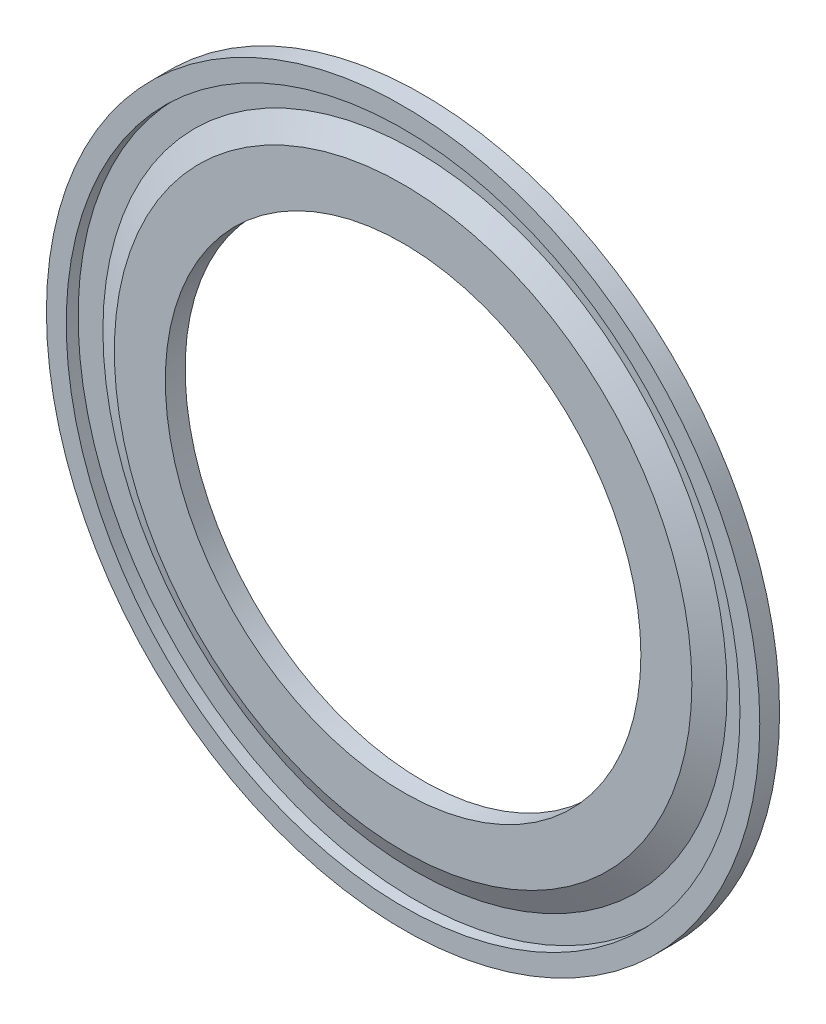
ISO-10303-21;
HEADER;
FILE_DESCRIPTION(('STEP AP214'),'2;1');
FILE_NAME('part.step','',(''),(''),'','','');
FILE_SCHEMA(('AUTOMOTIVE_DESIGN { 1 0 10303 214 1 1 1 1 }'));
ENDSEC;
DATA;
#1=APPLICATION_CONTEXT('core data for automotive mechanical design processes');
#2=APPLICATION_PROTOCOL_DEFINITION('international standard','automotive_design',2000,#1);
#3=PRODUCT_CONTEXT('',#1,'mechanical');
#4=PRODUCT('Part','Part','',(#3));
#5=PRODUCT_RELATED_PRODUCT_CATEGORY('part','',(#4));
#6=PRODUCT_DEFINITION_FORMATION('','',#4);
#7=PRODUCT_DEFINITION_CONTEXT('part definition',#1,'design');
#8=PRODUCT_DEFINITION('design','',#6,#7);
#9=PRODUCT_DEFINITION_SHAPE('','',#8);
#10=(LENGTH_UNIT() NAMED_UNIT(*) SI_UNIT(.MILLI.,.METRE.));
#11=(NAMED_UNIT(*) PLANE_ANGLE_UNIT() SI_UNIT($,.RADIAN.));
#12=(NAMED_UNIT(*) SI_UNIT($,.STERADIAN.) SOLID_ANGLE_UNIT());
#13=UNCERTAINTY_MEASURE_WITH_UNIT(LENGTH_MEASURE(1.E-05),#10,'distance_accuracy_value','');
#14=(GEOMETRIC_REPRESENTATION_CONTEXT(3) GLOBAL_UNCERTAINTY_ASSIGNED_CONTEXT((#13)) GLOBAL_UNIT_ASSIGNED_CONTEXT((#10,
#11,#12)) REPRESENTATION_CONTEXT('',''));
#15=CARTESIAN_POINT('',(0.,0.,0.));
#16=DIRECTION('',(0.,0.,1.));
#17=DIRECTION('',(1.,0.,0.));
#18=AXIS2_PLACEMENT_3D('',#15,#16,#17);
#19=CARTESIAN_POINT('',(-2.22044604925031E-13,12.0000000000002,0.499999999999612));
#20=DIRECTION('',(0.,0.,-1.));
#21=DIRECTION('',(-1.,0.,0.));
#22=AXIS2_PLACEMENT_3D('',#19,#20,#21);
#23=PLANE('',#22);
#24=CARTESIAN_POINT('',(0.,0.,0.499999999999945));
#25=DIRECTION('',(0.,0.,1.));
#26=DIRECTION('',(1.,0.,0.));
#27=AXIS2_PLACEMENT_3D('',#24,#25,#26);
#28=CIRCLE('',#27,12.);
#29=CARTESIAN_POINT('',(12.,0.,0.499999999999945));
#30=VERTEX_POINT('',#29);
#31=EDGE_CURVE('E56',#30,#30,#28,.T.);
#32=ORIENTED_EDGE('',*,*,#31,.F.);
#33=EDGE_LOOP('',(#32));
#34=FACE_BOUND('',#33,.T.);
#35=CARTESIAN_POINT('',(0.,0.,0.499999999999945));
#36=DIRECTION('',(0.,0.,1.));
#37=DIRECTION('',(1.,0.,0.));
#38=AXIS2_PLACEMENT_3D('',#35,#36,#37);
#39=CIRCLE('',#38,14.5724336966969);
#40=CARTESIAN_POINT('',(14.5724336966969,0.,0.499999999999945));
#41=VERTEX_POINT('',#40);
#42=EDGE_CURVE('E10',#41,#41,#39,.T.);
#43=ORIENTED_EDGE('',*,*,#42,.T.);
#44=EDGE_LOOP('',(#43));
#45=FACE_BOUND('',#44,.T.);
#46=ADVANCED_FACE('F28',(#34,#45),#23,.F.);
#47=CARTESIAN_POINT('',(0.,0.,-0.099999999999989));
#48=DIRECTION('',(0.,0.,-1.));
#49=DIRECTION('',(-1.,0.,0.));
#50=AXIS2_PLACEMENT_3D('',#47,#48,#49);
#51=CONICAL_SURFACE('',#50,15.75,1.09955742875643);
#52=ORIENTED_EDGE('',*,*,#42,.F.);
#53=EDGE_LOOP('',(#52));
#54=FACE_BOUND('',#53,.T.);
#55=CARTESIAN_POINT('',(0.,0.,-0.099999999999989));
#56=DIRECTION('',(0.,0.,1.));
#57=DIRECTION('',(1.,0.,0.));
#58=AXIS2_PLACEMENT_3D('',#55,#56,#57);
#59=CIRCLE('',#58,15.75);
#60=CARTESIAN_POINT('',(15.75,0.,-0.099999999999989));
#61=VERTEX_POINT('',#60);
#62=EDGE_CURVE('E34',#61,#61,#59,.T.);
#63=ORIENTED_EDGE('',*,*,#62,.T.);
#64=EDGE_LOOP('',(#63));
#65=FACE_BOUND('',#64,.T.);
#66=ADVANCED_FACE('F63',(#54,#65),#51,.T.);
#67=CARTESIAN_POINT('',(-4.44089209850063E-13,17.0000000000001,-0.100000000000322));
#68=DIRECTION('',(0.,0.,-1.));
#69=DIRECTION('',(-1.,0.,0.));
#70=AXIS2_PLACEMENT_3D('',#67,#68,#69);
#71=PLANE('',#70);
#72=ORIENTED_EDGE('',*,*,#62,.F.);
#73=EDGE_LOOP('',(#72));
#74=FACE_BOUND('',#73,.T.);
#75=CARTESIAN_POINT('',(0.,0.,-0.099999999999989));
#76=DIRECTION('',(0.,0.,1.));
#77=DIRECTION('',(1.,0.,0.));
#78=AXIS2_PLACEMENT_3D('',#75,#76,#77);
#79=CIRCLE('',#78,17.);
#80=CARTESIAN_POINT('',(17.,0.,-0.099999999999989));
#81=VERTEX_POINT('',#80);
#82=EDGE_CURVE('E38',#81,#81,#79,.T.);
#83=ORIENTED_EDGE('',*,*,#82,.T.);
#84=EDGE_LOOP('',(#83));
#85=FACE_BOUND('',#84,.T.);
#86=ADVANCED_FACE('F67',(#74,#85),#71,.F.);
#87=CARTESIAN_POINT('',(0.,0.,0.));
#88=DIRECTION('',(0.,0.,1.));
#89=DIRECTION('',(1.,0.,0.));
#90=AXIS2_PLACEMENT_3D('',#87,#88,#89);
#91=CYLINDRICAL_SURFACE('',#90,17.);
#92=ORIENTED_EDGE('',*,*,#82,.F.);
#93=EDGE_LOOP('',(#92));
#94=FACE_BOUND('',#93,.T.);
#95=CARTESIAN_POINT('',(0.,0.,0.499999999999945));
#96=DIRECTION('',(0.,0.,1.));
#97=DIRECTION('',(1.,0.,0.));
#98=AXIS2_PLACEMENT_3D('',#95,#96,#97);
#99=CIRCLE('',#98,17.);
#100=CARTESIAN_POINT('',(17.,0.,0.499999999999945));
#101=VERTEX_POINT('',#100);
#102=EDGE_CURVE('E42',#101,#101,#99,.T.);
#103=ORIENTED_EDGE('',*,*,#102,.T.);
#104=EDGE_LOOP('',(#103));
#105=FACE_BOUND('',#104,.T.);
#106=ADVANCED_FACE('F72',(#94,#105),#91,.F.);
#107=CARTESIAN_POINT('',(-4.44089209850063E-13,17.0000000000001,0.499999999999612));
#108=DIRECTION('',(0.,0.,-1.));
#109=DIRECTION('',(-1.,0.,0.));
#110=AXIS2_PLACEMENT_3D('',#107,#108,#109);
#111=PLANE('',#110);
#112=ORIENTED_EDGE('',*,*,#102,.F.);
#113=EDGE_LOOP('',(#112));
#114=FACE_BOUND('',#113,.T.);
#115=CARTESIAN_POINT('',(0.,0.,0.499999999999945));
#116=DIRECTION('',(0.,0.,1.));
#117=DIRECTION('',(1.,0.,0.));
#118=AXIS2_PLACEMENT_3D('',#115,#116,#117);
#119=CIRCLE('',#118,18.);
#120=CARTESIAN_POINT('',(18.,0.,0.499999999999945));
#121=VERTEX_POINT('',#120);
#122=EDGE_CURVE('E47',#121,#121,#119,.T.);
#123=ORIENTED_EDGE('',*,*,#122,.T.);
#124=EDGE_LOOP('',(#123));
#125=FACE_BOUND('',#124,.T.);
#126=ADVANCED_FACE('F78',(#114,#125),#111,.F.);
#127=CARTESIAN_POINT('',(0.,0.,0.));
#128=DIRECTION('',(0.,0.,1.));
#129=DIRECTION('',(1.,0.,0.));
#130=AXIS2_PLACEMENT_3D('',#127,#128,#129);
#131=CYLINDRICAL_SURFACE('',#130,18.);
#132=ORIENTED_EDGE('',*,*,#122,.F.);
#133=EDGE_LOOP('',(#132));
#134=FACE_BOUND('',#133,.T.);
#135=CARTESIAN_POINT('',(-6.66133814775094E-13,0.,-0.499999999999945));
#136=DIRECTION('',(0.,0.,1.));
#137=DIRECTION('',(1.,0.,0.));
#138=AXIS2_PLACEMENT_3D('',#135,#136,#137);
#139=CIRCLE('',#138,18.);
#140=CARTESIAN_POINT('',(17.9999999999993,0.,-0.499999999999945));
#141=VERTEX_POINT('',#140);
#142=EDGE_CURVE('E50',#141,#141,#139,.T.);
#143=ORIENTED_EDGE('',*,*,#142,.T.);
#144=EDGE_LOOP('',(#143));
#145=FACE_BOUND('',#144,.T.);
#146=ADVANCED_FACE('F82',(#134,#145),#131,.T.);
#147=CARTESIAN_POINT('',(-2.22044604925031E-13,12.0000000000002,-0.500000000000278));
#148=DIRECTION('',(0.,0.,1.));
#149=DIRECTION('',(1.,0.,0.));
#150=AXIS2_PLACEMENT_3D('',#147,#148,#149);
#151=PLANE('',#150);
#152=ORIENTED_EDGE('',*,*,#142,.F.);
#153=EDGE_LOOP('',(#152));
#154=FACE_BOUND('',#153,.T.);
#155=CARTESIAN_POINT('',(-6.66133814775094E-13,0.,-0.499999999999945));
#156=DIRECTION('',(0.,0.,1.));
#157=DIRECTION('',(1.,0.,0.));
#158=AXIS2_PLACEMENT_3D('',#155,#156,#157);
#159=CIRCLE('',#158,12.);
#160=CARTESIAN_POINT('',(11.9999999999993,0.,-0.499999999999945));
#161=VERTEX_POINT('',#160);
#162=EDGE_CURVE('E53',#161,#161,#159,.T.);
#163=ORIENTED_EDGE('',*,*,#162,.T.);
#164=EDGE_LOOP('',(#163));
#165=FACE_BOUND('',#164,.T.);
#166=ADVANCED_FACE('F86',(#154,#165),#151,.F.);
#167=CARTESIAN_POINT('',(0.,0.,0.));
#168=DIRECTION('',(0.,0.,1.));
#169=DIRECTION('',(1.,0.,0.));
#170=AXIS2_PLACEMENT_3D('',#167,#168,#169);
#171=CYLINDRICAL_SURFACE('',#170,12.);
#172=ORIENTED_EDGE('',*,*,#162,.F.);
#173=EDGE_LOOP('',(#172));
#174=FACE_BOUND('',#173,.T.);
#175=ORIENTED_EDGE('',*,*,#31,.T.);
#176=EDGE_LOOP('',(#175));
#177=FACE_BOUND('',#176,.T.);
#178=ADVANCED_FACE('F60',(#174,#177),#171,.F.);
#179=CLOSED_SHELL('',(#46,#66,#86,#106,#126,#146,#166,#178));
#180=MANIFOLD_SOLID_BREP('B2',#179);
#181=ADVANCED_BREP_SHAPE_REPRESENTATION('',(#18,#180),#14);
#182=SHAPE_DEFINITION_REPRESENTATION(#9,#181);
ENDSEC;
END-ISO-10303-21;
